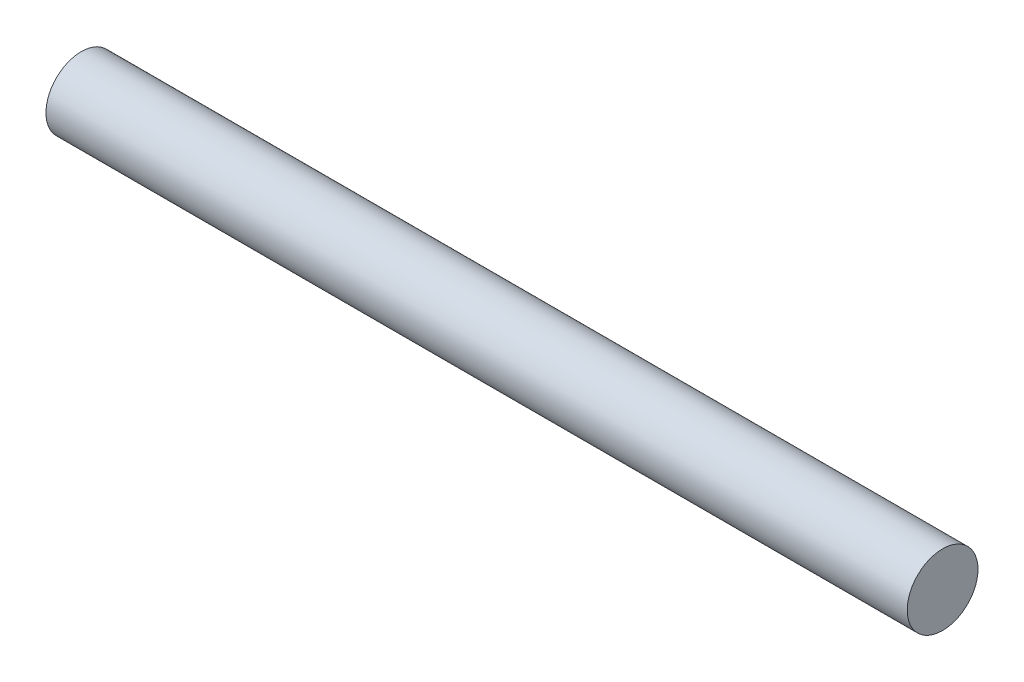
ISO-10303-21;
HEADER;
FILE_DESCRIPTION(('STEP AP214'),'2;1');
FILE_NAME('part.step','',(''),(''),'','','');
FILE_SCHEMA(('AUTOMOTIVE_DESIGN { 1 0 10303 214 1 1 1 1 }'));
ENDSEC;
DATA;
#1=APPLICATION_CONTEXT('core data for automotive mechanical design processes');
#2=APPLICATION_PROTOCOL_DEFINITION('international standard','automotive_design',2000,#1);
#3=PRODUCT_CONTEXT('',#1,'mechanical');
#4=PRODUCT('Part','Part','',(#3));
#5=PRODUCT_RELATED_PRODUCT_CATEGORY('part','',(#4));
#6=PRODUCT_DEFINITION_FORMATION('','',#4);
#7=PRODUCT_DEFINITION_CONTEXT('part definition',#1,'design');
#8=PRODUCT_DEFINITION('design','',#6,#7);
#9=PRODUCT_DEFINITION_SHAPE('','',#8);
#10=(LENGTH_UNIT() NAMED_UNIT(*) SI_UNIT(.MILLI.,.METRE.));
#11=(NAMED_UNIT(*) PLANE_ANGLE_UNIT() SI_UNIT($,.RADIAN.));
#12=(NAMED_UNIT(*) SI_UNIT($,.STERADIAN.) SOLID_ANGLE_UNIT());
#13=UNCERTAINTY_MEASURE_WITH_UNIT(LENGTH_MEASURE(1.E-05),#10,'distance_accuracy_value','');
#14=(GEOMETRIC_REPRESENTATION_CONTEXT(3) GLOBAL_UNCERTAINTY_ASSIGNED_CONTEXT((#13)) GLOBAL_UNIT_ASSIGNED_CONTEXT((#10,
#11,#12)) REPRESENTATION_CONTEXT('',''));
#15=CARTESIAN_POINT('',(0.,0.,0.));
#16=DIRECTION('',(0.,0.,1.));
#17=DIRECTION('',(1.,0.,0.));
#18=AXIS2_PLACEMENT_3D('',#15,#16,#17);
#19=CARTESIAN_POINT('',(36.5,0.,0.));
#20=DIRECTION('',(-1.,0.,0.));
#21=DIRECTION('',(0.,0.,1.));
#22=AXIS2_PLACEMENT_3D('',#19,#20,#21);
#23=CYLINDRICAL_SURFACE('',#22,1.5);
#24=CARTESIAN_POINT('',(36.5,0.,0.));
#25=DIRECTION('',(1.,0.,0.));
#26=DIRECTION('',(0.,0.,-1.));
#27=AXIS2_PLACEMENT_3D('',#24,#25,#26);
#28=CIRCLE('',#27,1.5);
#29=CARTESIAN_POINT('',(36.5,0.,-1.5));
#30=VERTEX_POINT('',#29);
#31=EDGE_CURVE('E10',#30,#30,#28,.T.);
#32=ORIENTED_EDGE('',*,*,#31,.F.);
#33=EDGE_LOOP('',(#32));
#34=FACE_BOUND('',#33,.T.);
#35=CARTESIAN_POINT('',(0.,0.,0.));
#36=DIRECTION('',(1.,0.,0.));
#37=DIRECTION('',(0.,0.,-1.));
#38=AXIS2_PLACEMENT_3D('',#35,#36,#37);
#39=CIRCLE('',#38,1.5);
#40=CARTESIAN_POINT('',(0.,0.,-1.5));
#41=VERTEX_POINT('',#40);
#42=EDGE_CURVE('E34',#41,#41,#39,.T.);
#43=ORIENTED_EDGE('',*,*,#42,.T.);
#44=EDGE_LOOP('',(#43));
#45=FACE_BOUND('',#44,.T.);
#46=ADVANCED_FACE('F31',(#34,#45),#23,.T.);
#47=CARTESIAN_POINT('',(36.5,0.,0.));
#48=DIRECTION('',(1.,0.,0.));
#49=DIRECTION('',(0.,0.,-1.));
#50=AXIS2_PLACEMENT_3D('',#47,#48,#49);
#51=PLANE('',#50);
#52=ORIENTED_EDGE('',*,*,#31,.T.);
#53=EDGE_LOOP('',(#52));
#54=FACE_BOUND('',#53,.T.);
#55=ADVANCED_FACE('F46',(#54),#51,.T.);
#56=CARTESIAN_POINT('',(0.,0.,0.));
#57=DIRECTION('',(1.,0.,0.));
#58=DIRECTION('',(0.,0.,-1.));
#59=AXIS2_PLACEMENT_3D('',#56,#57,#58);
#60=PLANE('',#59);
#61=ORIENTED_EDGE('',*,*,#42,.F.);
#62=EDGE_LOOP('',(#61));
#63=FACE_BOUND('',#62,.T.);
#64=ADVANCED_FACE('F44',(#63),#60,.F.);
#65=CLOSED_SHELL('',(#46,#55,#64));
#66=MANIFOLD_SOLID_BREP('B2',#65);
#67=ADVANCED_BREP_SHAPE_REPRESENTATION('',(#18,#66),#14);
#68=SHAPE_DEFINITION_REPRESENTATION(#9,#67);
ENDSEC;
END-ISO-10303-21;
